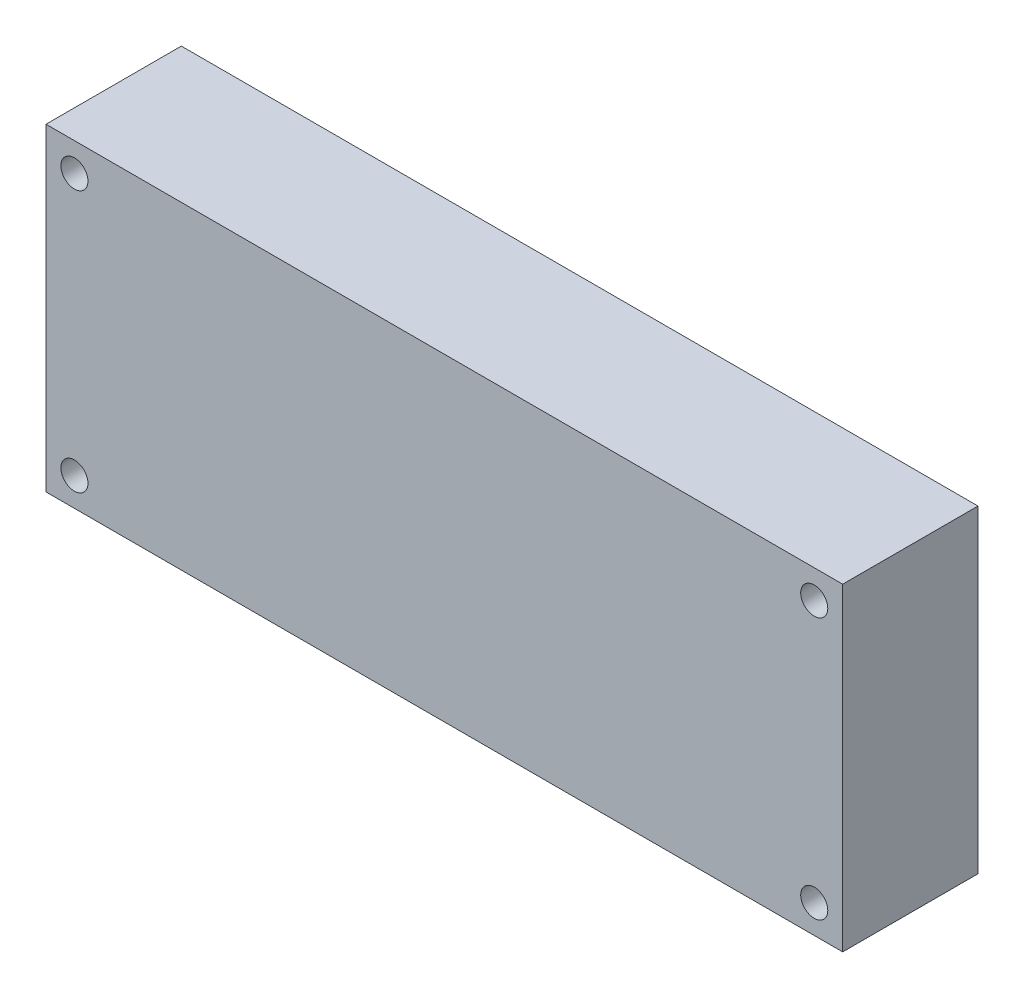
ISO-10303-21;
HEADER;
FILE_DESCRIPTION(('STEP AP214'),'2;1');
FILE_NAME('part.step','',(''),(''),'','','');
FILE_SCHEMA(('AUTOMOTIVE_DESIGN { 1 0 10303 214 1 1 1 1 }'));
ENDSEC;
DATA;
#1=APPLICATION_CONTEXT('core data for automotive mechanical design processes');
#2=APPLICATION_PROTOCOL_DEFINITION('international standard','automotive_design',2000,#1);
#3=PRODUCT_CONTEXT('',#1,'mechanical');
#4=PRODUCT('Part','Part','',(#3));
#5=PRODUCT_RELATED_PRODUCT_CATEGORY('part','',(#4));
#6=PRODUCT_DEFINITION_FORMATION('','',#4);
#7=PRODUCT_DEFINITION_CONTEXT('part definition',#1,'design');
#8=PRODUCT_DEFINITION('design','',#6,#7);
#9=PRODUCT_DEFINITION_SHAPE('','',#8);
#10=(LENGTH_UNIT() NAMED_UNIT(*) SI_UNIT(.MILLI.,.METRE.));
#11=(NAMED_UNIT(*) PLANE_ANGLE_UNIT() SI_UNIT($,.RADIAN.));
#12=(NAMED_UNIT(*) SI_UNIT($,.STERADIAN.) SOLID_ANGLE_UNIT());
#13=UNCERTAINTY_MEASURE_WITH_UNIT(LENGTH_MEASURE(1.E-05),#10,'distance_accuracy_value','');
#14=(GEOMETRIC_REPRESENTATION_CONTEXT(3) GLOBAL_UNCERTAINTY_ASSIGNED_CONTEXT((#13)) GLOBAL_UNIT_ASSIGNED_CONTEXT((#10,
#11,#12)) REPRESENTATION_CONTEXT('',''));
#15=CARTESIAN_POINT('',(0.,0.,0.));
#16=DIRECTION('',(0.,0.,1.));
#17=DIRECTION('',(1.,0.,0.));
#18=AXIS2_PLACEMENT_3D('',#15,#16,#17);
#19=CARTESIAN_POINT('',(44.15,-17.65,15.));
#20=DIRECTION('',(0.,0.,1.));
#21=DIRECTION('',(1.,0.,0.));
#22=AXIS2_PLACEMENT_3D('',#19,#20,#21);
#23=PLANE('',#22);
#24=CARTESIAN_POINT('',(41.,-14.5,15.));
#25=DIRECTION('',(0.,0.,1.));
#26=DIRECTION('',(1.,0.,0.));
#27=AXIS2_PLACEMENT_3D('',#24,#25,#26);
#28=CIRCLE('',#27,1.5);
#29=CARTESIAN_POINT('',(42.5,-14.5,15.));
#30=VERTEX_POINT('',#29);
#31=EDGE_CURVE('E119',#30,#30,#28,.T.);
#32=ORIENTED_EDGE('',*,*,#31,.F.);
#33=EDGE_LOOP('',(#32));
#34=FACE_BOUND('',#33,.T.);
#35=CARTESIAN_POINT('',(-41.,14.5,15.));
#36=DIRECTION('',(0.,0.,1.));
#37=DIRECTION('',(1.,0.,0.));
#38=AXIS2_PLACEMENT_3D('',#35,#36,#37);
#39=CIRCLE('',#38,1.5);
#40=CARTESIAN_POINT('',(-39.5,14.5,15.));
#41=VERTEX_POINT('',#40);
#42=EDGE_CURVE('E98',#41,#41,#39,.T.);
#43=ORIENTED_EDGE('',*,*,#42,.F.);
#44=EDGE_LOOP('',(#43));
#45=FACE_BOUND('',#44,.T.);
#46=DIRECTION('',(0.,1.,0.));
#47=VECTOR('',#46,1.);
#48=CARTESIAN_POINT('',(44.15,17.65,15.));
#49=LINE('',#48,#47);
#50=CARTESIAN_POINT('',(44.15,-17.65,15.));
#51=VERTEX_POINT('',#50);
#52=CARTESIAN_POINT('',(44.15,17.65,15.));
#53=VERTEX_POINT('',#52);
#54=EDGE_CURVE('E83',#51,#53,#49,.T.);
#55=ORIENTED_EDGE('',*,*,#54,.T.);
#56=DIRECTION('',(-1.,0.,0.));
#57=VECTOR('',#56,1.);
#58=CARTESIAN_POINT('',(-44.15,17.65,15.));
#59=LINE('',#58,#57);
#60=CARTESIAN_POINT('',(-44.15,17.65,15.));
#61=VERTEX_POINT('',#60);
#62=EDGE_CURVE('E78',#53,#61,#59,.T.);
#63=ORIENTED_EDGE('',*,*,#62,.T.);
#64=DIRECTION('',(0.,-1.,0.));
#65=VECTOR('',#64,1.);
#66=CARTESIAN_POINT('',(-44.15,17.65,15.));
#67=LINE('',#66,#65);
#68=CARTESIAN_POINT('',(-44.15,-17.65,15.));
#69=VERTEX_POINT('',#68);
#70=EDGE_CURVE('E81',#61,#69,#67,.T.);
#71=ORIENTED_EDGE('',*,*,#70,.T.);
#72=DIRECTION('',(1.,0.,0.));
#73=VECTOR('',#72,1.);
#74=CARTESIAN_POINT('',(-44.15,-17.65,15.));
#75=LINE('',#74,#73);
#76=EDGE_CURVE('E48',#69,#51,#75,.T.);
#77=ORIENTED_EDGE('',*,*,#76,.T.);
#78=EDGE_LOOP('',(#55,#63,#71,#77));
#79=FACE_BOUND('',#78,.T.);
#80=CARTESIAN_POINT('',(-41.,-14.5,15.));
#81=DIRECTION('',(0.,0.,1.));
#82=DIRECTION('',(1.,0.,0.));
#83=AXIS2_PLACEMENT_3D('',#80,#81,#82);
#84=CIRCLE('',#83,1.5);
#85=CARTESIAN_POINT('',(-39.5,-14.5,15.));
#86=VERTEX_POINT('',#85);
#87=EDGE_CURVE('E113',#86,#86,#84,.T.);
#88=ORIENTED_EDGE('',*,*,#87,.F.);
#89=EDGE_LOOP('',(#88));
#90=FACE_BOUND('',#89,.T.);
#91=CARTESIAN_POINT('',(41.,14.5,15.));
#92=DIRECTION('',(0.,0.,1.));
#93=DIRECTION('',(1.,0.,0.));
#94=AXIS2_PLACEMENT_3D('',#91,#92,#93);
#95=CIRCLE('',#94,1.5);
#96=CARTESIAN_POINT('',(42.5,14.5,15.));
#97=VERTEX_POINT('',#96);
#98=EDGE_CURVE('E125',#97,#97,#95,.T.);
#99=ORIENTED_EDGE('',*,*,#98,.F.);
#100=EDGE_LOOP('',(#99));
#101=FACE_BOUND('',#100,.T.);
#102=ADVANCED_FACE('F31',(#34,#45,#79,#90,#101),#23,.T.);
#103=CARTESIAN_POINT('',(44.15,-17.65,0.));
#104=DIRECTION('',(0.,0.,1.));
#105=DIRECTION('',(1.,0.,0.));
#106=AXIS2_PLACEMENT_3D('',#103,#104,#105);
#107=PLANE('',#106);
#108=CARTESIAN_POINT('',(41.,-14.5,0.));
#109=DIRECTION('',(0.,0.,1.));
#110=DIRECTION('',(1.,0.,0.));
#111=AXIS2_PLACEMENT_3D('',#108,#109,#110);
#112=CIRCLE('',#111,1.5);
#113=CARTESIAN_POINT('',(42.5,-14.5,0.));
#114=VERTEX_POINT('',#113);
#115=EDGE_CURVE('E122',#114,#114,#112,.T.);
#116=ORIENTED_EDGE('',*,*,#115,.T.);
#117=EDGE_LOOP('',(#116));
#118=FACE_BOUND('',#117,.T.);
#119=CARTESIAN_POINT('',(-41.,14.5,0.));
#120=DIRECTION('',(0.,0.,1.));
#121=DIRECTION('',(1.,0.,0.));
#122=AXIS2_PLACEMENT_3D('',#119,#120,#121);
#123=CIRCLE('',#122,1.5);
#124=CARTESIAN_POINT('',(-39.5,14.5,0.));
#125=VERTEX_POINT('',#124);
#126=EDGE_CURVE('E110',#125,#125,#123,.T.);
#127=ORIENTED_EDGE('',*,*,#126,.T.);
#128=EDGE_LOOP('',(#127));
#129=FACE_BOUND('',#128,.T.);
#130=DIRECTION('',(0.,1.,0.));
#131=VECTOR('',#130,1.);
#132=CARTESIAN_POINT('',(44.15,17.65,0.));
#133=LINE('',#132,#131);
#134=CARTESIAN_POINT('',(44.15,-17.65,0.));
#135=VERTEX_POINT('',#134);
#136=CARTESIAN_POINT('',(44.15,17.65,0.));
#137=VERTEX_POINT('',#136);
#138=EDGE_CURVE('E95',#135,#137,#133,.T.);
#139=ORIENTED_EDGE('',*,*,#138,.F.);
#140=DIRECTION('',(1.,0.,0.));
#141=VECTOR('',#140,1.);
#142=CARTESIAN_POINT('',(-44.15,-17.65,0.));
#143=LINE('',#142,#141);
#144=CARTESIAN_POINT('',(-44.15,-17.65,0.));
#145=VERTEX_POINT('',#144);
#146=EDGE_CURVE('E71',#145,#135,#143,.T.);
#147=ORIENTED_EDGE('',*,*,#146,.F.);
#148=DIRECTION('',(0.,-1.,0.));
#149=VECTOR('',#148,1.);
#150=CARTESIAN_POINT('',(-44.15,17.65,0.));
#151=LINE('',#150,#149);
#152=CARTESIAN_POINT('',(-44.15,17.65,0.));
#153=VERTEX_POINT('',#152);
#154=EDGE_CURVE('E65',#153,#145,#151,.T.);
#155=ORIENTED_EDGE('',*,*,#154,.F.);
#156=DIRECTION('',(-1.,0.,0.));
#157=VECTOR('',#156,1.);
#158=CARTESIAN_POINT('',(-44.15,17.65,0.));
#159=LINE('',#158,#157);
#160=EDGE_CURVE('E87',#137,#153,#159,.T.);
#161=ORIENTED_EDGE('',*,*,#160,.F.);
#162=EDGE_LOOP('',(#139,#147,#155,#161));
#163=FACE_BOUND('',#162,.T.);
#164=CARTESIAN_POINT('',(-41.,-14.5,0.));
#165=DIRECTION('',(0.,0.,1.));
#166=DIRECTION('',(1.,0.,0.));
#167=AXIS2_PLACEMENT_3D('',#164,#165,#166);
#168=CIRCLE('',#167,1.5);
#169=CARTESIAN_POINT('',(-39.5,-14.5,0.));
#170=VERTEX_POINT('',#169);
#171=EDGE_CURVE('E116',#170,#170,#168,.T.);
#172=ORIENTED_EDGE('',*,*,#171,.T.);
#173=EDGE_LOOP('',(#172));
#174=FACE_BOUND('',#173,.T.);
#175=CARTESIAN_POINT('',(41.,14.5,0.));
#176=DIRECTION('',(0.,0.,1.));
#177=DIRECTION('',(1.,0.,0.));
#178=AXIS2_PLACEMENT_3D('',#175,#176,#177);
#179=CIRCLE('',#178,1.5);
#180=CARTESIAN_POINT('',(42.5,14.5,0.));
#181=VERTEX_POINT('',#180);
#182=EDGE_CURVE('E128',#181,#181,#179,.T.);
#183=ORIENTED_EDGE('',*,*,#182,.T.);
#184=EDGE_LOOP('',(#183));
#185=FACE_BOUND('',#184,.T.);
#186=ADVANCED_FACE('F106',(#118,#129,#163,#174,#185),#107,.F.);
#187=CARTESIAN_POINT('',(44.15,17.65,15.));
#188=DIRECTION('',(-1.,0.,0.));
#189=DIRECTION('',(0.,0.,1.));
#190=AXIS2_PLACEMENT_3D('',#187,#188,#189);
#191=PLANE('',#190);
#192=ORIENTED_EDGE('',*,*,#138,.T.);
#193=DIRECTION('',(0.,0.,-1.));
#194=VECTOR('',#193,1.);
#195=CARTESIAN_POINT('',(44.15,17.65,15.));
#196=LINE('',#195,#194);
#197=EDGE_CURVE('E11',#53,#137,#196,.T.);
#198=ORIENTED_EDGE('',*,*,#197,.F.);
#199=ORIENTED_EDGE('',*,*,#54,.F.);
#200=DIRECTION('',(0.,0.,-1.));
#201=VECTOR('',#200,1.);
#202=CARTESIAN_POINT('',(44.15,-17.65,15.));
#203=LINE('',#202,#201);
#204=EDGE_CURVE('E91',#51,#135,#203,.T.);
#205=ORIENTED_EDGE('',*,*,#204,.T.);
#206=EDGE_LOOP('',(#192,#198,#199,#205));
#207=FACE_BOUND('',#206,.T.);
#208=ADVANCED_FACE('F33',(#207),#191,.F.);
#209=CARTESIAN_POINT('',(-44.15,17.65,15.));
#210=DIRECTION('',(0.,-1.,0.));
#211=DIRECTION('',(0.,0.,-1.));
#212=AXIS2_PLACEMENT_3D('',#209,#210,#211);
#213=PLANE('',#212);
#214=ORIENTED_EDGE('',*,*,#160,.T.);
#215=DIRECTION('',(0.,0.,-1.));
#216=VECTOR('',#215,1.);
#217=CARTESIAN_POINT('',(-44.15,17.65,15.));
#218=LINE('',#217,#216);
#219=EDGE_CURVE('E40',#61,#153,#218,.T.);
#220=ORIENTED_EDGE('',*,*,#219,.F.);
#221=ORIENTED_EDGE('',*,*,#62,.F.);
#222=ORIENTED_EDGE('',*,*,#197,.T.);
#223=EDGE_LOOP('',(#214,#220,#221,#222));
#224=FACE_BOUND('',#223,.T.);
#225=ADVANCED_FACE('F86',(#224),#213,.F.);
#226=CARTESIAN_POINT('',(-44.15,17.65,15.));
#227=DIRECTION('',(1.,0.,0.));
#228=DIRECTION('',(0.,0.,-1.));
#229=AXIS2_PLACEMENT_3D('',#226,#227,#228);
#230=PLANE('',#229);
#231=ORIENTED_EDGE('',*,*,#154,.T.);
#232=DIRECTION('',(0.,0.,-1.));
#233=VECTOR('',#232,1.);
#234=CARTESIAN_POINT('',(-44.15,-17.65,15.));
#235=LINE('',#234,#233);
#236=EDGE_CURVE('E88',#69,#145,#235,.T.);
#237=ORIENTED_EDGE('',*,*,#236,.F.);
#238=ORIENTED_EDGE('',*,*,#70,.F.);
#239=ORIENTED_EDGE('',*,*,#219,.T.);
#240=EDGE_LOOP('',(#231,#237,#238,#239));
#241=FACE_BOUND('',#240,.T.);
#242=ADVANCED_FACE('F89',(#241),#230,.F.);
#243=CARTESIAN_POINT('',(-44.15,-17.65,15.));
#244=DIRECTION('',(0.,1.,0.));
#245=DIRECTION('',(0.,0.,1.));
#246=AXIS2_PLACEMENT_3D('',#243,#244,#245);
#247=PLANE('',#246);
#248=ORIENTED_EDGE('',*,*,#146,.T.);
#249=ORIENTED_EDGE('',*,*,#204,.F.);
#250=ORIENTED_EDGE('',*,*,#76,.F.);
#251=ORIENTED_EDGE('',*,*,#236,.T.);
#252=EDGE_LOOP('',(#248,#249,#250,#251));
#253=FACE_BOUND('',#252,.T.);
#254=ADVANCED_FACE('F103',(#253),#247,.F.);
#255=CARTESIAN_POINT('',(-41.,14.5,15.));
#256=DIRECTION('',(0.,0.,-1.));
#257=DIRECTION('',(-1.,0.,0.));
#258=AXIS2_PLACEMENT_3D('',#255,#256,#257);
#259=CYLINDRICAL_SURFACE('',#258,1.5);
#260=ORIENTED_EDGE('',*,*,#42,.T.);
#261=EDGE_LOOP('',(#260));
#262=FACE_BOUND('',#261,.T.);
#263=ORIENTED_EDGE('',*,*,#126,.F.);
#264=EDGE_LOOP('',(#263));
#265=FACE_BOUND('',#264,.T.);
#266=ADVANCED_FACE('F148',(#262,#265),#259,.F.);
#267=CARTESIAN_POINT('',(-41.,-14.5,15.));
#268=DIRECTION('',(0.,0.,-1.));
#269=DIRECTION('',(-1.,0.,0.));
#270=AXIS2_PLACEMENT_3D('',#267,#268,#269);
#271=CYLINDRICAL_SURFACE('',#270,1.5);
#272=ORIENTED_EDGE('',*,*,#87,.T.);
#273=EDGE_LOOP('',(#272));
#274=FACE_BOUND('',#273,.T.);
#275=ORIENTED_EDGE('',*,*,#171,.F.);
#276=EDGE_LOOP('',(#275));
#277=FACE_BOUND('',#276,.T.);
#278=ADVANCED_FACE('F194',(#274,#277),#271,.F.);
#279=CARTESIAN_POINT('',(41.,-14.5,15.));
#280=DIRECTION('',(0.,0.,-1.));
#281=DIRECTION('',(-1.,0.,0.));
#282=AXIS2_PLACEMENT_3D('',#279,#280,#281);
#283=CYLINDRICAL_SURFACE('',#282,1.5);
#284=ORIENTED_EDGE('',*,*,#31,.T.);
#285=EDGE_LOOP('',(#284));
#286=FACE_BOUND('',#285,.T.);
#287=ORIENTED_EDGE('',*,*,#115,.F.);
#288=EDGE_LOOP('',(#287));
#289=FACE_BOUND('',#288,.T.);
#290=ADVANCED_FACE('F202',(#286,#289),#283,.F.);
#291=CARTESIAN_POINT('',(41.,14.5,15.));
#292=DIRECTION('',(0.,0.,-1.));
#293=DIRECTION('',(-1.,0.,0.));
#294=AXIS2_PLACEMENT_3D('',#291,#292,#293);
#295=CYLINDRICAL_SURFACE('',#294,1.5);
#296=ORIENTED_EDGE('',*,*,#98,.T.);
#297=EDGE_LOOP('',(#296));
#298=FACE_BOUND('',#297,.T.);
#299=ORIENTED_EDGE('',*,*,#182,.F.);
#300=EDGE_LOOP('',(#299));
#301=FACE_BOUND('',#300,.T.);
#302=ADVANCED_FACE('F134',(#298,#301),#295,.F.);
#303=CLOSED_SHELL('',(#102,#186,#208,#225,#242,#254,#266,#278,#290,#302));
#304=MANIFOLD_SOLID_BREP('B2',#303);
#305=ADVANCED_BREP_SHAPE_REPRESENTATION('',(#18,#304),#14);
#306=SHAPE_DEFINITION_REPRESENTATION(#9,#305);
ENDSEC;
END-ISO-10303-21;
